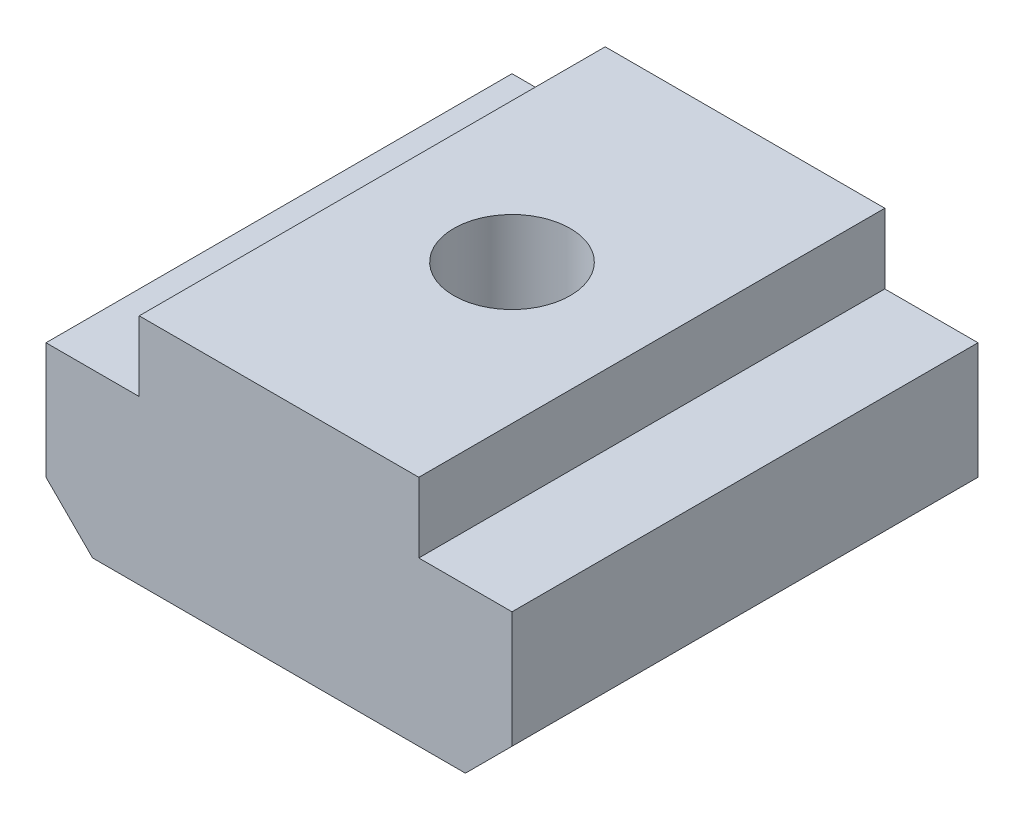
ISO-10303-21;
HEADER;
FILE_DESCRIPTION(('STEP AP214'),'2;1');
FILE_NAME('part.step','',(''),(''),'','','');
FILE_SCHEMA(('AUTOMOTIVE_DESIGN { 1 0 10303 214 1 1 1 1 }'));
ENDSEC;
DATA;
#1=APPLICATION_CONTEXT('core data for automotive mechanical design processes');
#2=APPLICATION_PROTOCOL_DEFINITION('international standard','automotive_design',2000,#1);
#3=PRODUCT_CONTEXT('',#1,'mechanical');
#4=PRODUCT('Part','Part','',(#3));
#5=PRODUCT_RELATED_PRODUCT_CATEGORY('part','',(#4));
#6=PRODUCT_DEFINITION_FORMATION('','',#4);
#7=PRODUCT_DEFINITION_CONTEXT('part definition',#1,'design');
#8=PRODUCT_DEFINITION('design','',#6,#7);
#9=PRODUCT_DEFINITION_SHAPE('','',#8);
#10=(LENGTH_UNIT() NAMED_UNIT(*) SI_UNIT(.MILLI.,.METRE.));
#11=(NAMED_UNIT(*) PLANE_ANGLE_UNIT() SI_UNIT($,.RADIAN.));
#12=(NAMED_UNIT(*) SI_UNIT($,.STERADIAN.) SOLID_ANGLE_UNIT());
#13=UNCERTAINTY_MEASURE_WITH_UNIT(LENGTH_MEASURE(1.E-05),#10,'distance_accuracy_value','');
#14=(GEOMETRIC_REPRESENTATION_CONTEXT(3) GLOBAL_UNCERTAINTY_ASSIGNED_CONTEXT((#13)) GLOBAL_UNIT_ASSIGNED_CONTEXT((#10,
#11,#12)) REPRESENTATION_CONTEXT('',''));
#15=CARTESIAN_POINT('',(0.,0.,0.));
#16=DIRECTION('',(0.,0.,1.));
#17=DIRECTION('',(1.,0.,0.));
#18=AXIS2_PLACEMENT_3D('',#15,#16,#17);
#19=CARTESIAN_POINT('',(-5.,1.,10.));
#20=DIRECTION('',(0.707106781186548,0.707106781186548,0.));
#21=DIRECTION('',(-0.707106781186548,0.707106781186548,0.));
#22=AXIS2_PLACEMENT_3D('',#19,#20,#21);
#23=PLANE('',#22);
#24=DIRECTION('',(0.707106781186548,-0.707106781186548,0.));
#25=VECTOR('',#24,1.);
#26=CARTESIAN_POINT('',(-5.,1.,0.));
#27=LINE('',#26,#25);
#28=CARTESIAN_POINT('',(-5.,1.,0.));
#29=VERTEX_POINT('',#28);
#30=CARTESIAN_POINT('',(-4.,0.,0.));
#31=VERTEX_POINT('',#30);
#32=EDGE_CURVE('E144',#29,#31,#27,.T.);
#33=ORIENTED_EDGE('',*,*,#32,.T.);
#34=DIRECTION('',(0.,0.,-1.));
#35=VECTOR('',#34,1.);
#36=CARTESIAN_POINT('',(-4.,0.,10.));
#37=LINE('',#36,#35);
#38=CARTESIAN_POINT('',(-4.,0.,10.));
#39=VERTEX_POINT('',#38);
#40=EDGE_CURVE('E11',#39,#31,#37,.T.);
#41=ORIENTED_EDGE('',*,*,#40,.F.);
#42=DIRECTION('',(0.707106781186548,-0.707106781186548,0.));
#43=VECTOR('',#42,1.);
#44=CARTESIAN_POINT('',(-5.,1.,10.));
#45=LINE('',#44,#43);
#46=CARTESIAN_POINT('',(-5.,1.,10.));
#47=VERTEX_POINT('',#46);
#48=EDGE_CURVE('E163',#47,#39,#45,.T.);
#49=ORIENTED_EDGE('',*,*,#48,.F.);
#50=DIRECTION('',(0.,0.,-1.));
#51=VECTOR('',#50,1.);
#52=CARTESIAN_POINT('',(-5.,1.,10.));
#53=LINE('',#52,#51);
#54=EDGE_CURVE('E140',#47,#29,#53,.T.);
#55=ORIENTED_EDGE('',*,*,#54,.T.);
#56=EDGE_LOOP('',(#33,#41,#49,#55));
#57=FACE_BOUND('',#56,.T.);
#58=ADVANCED_FACE('F36',(#57),#23,.F.);
#59=CARTESIAN_POINT('',(-4.,0.,10.));
#60=DIRECTION('',(0.,1.,0.));
#61=DIRECTION('',(0.,0.,1.));
#62=AXIS2_PLACEMENT_3D('',#59,#60,#61);
#63=PLANE('',#62);
#64=CARTESIAN_POINT('',(0.,0.,5.));
#65=DIRECTION('',(0.,1.,0.));
#66=DIRECTION('',(0.,0.,1.));
#67=AXIS2_PLACEMENT_3D('',#64,#65,#66);
#68=CIRCLE('',#67,1.25);
#69=CARTESIAN_POINT('',(0.,0.,6.25));
#70=VERTEX_POINT('',#69);
#71=EDGE_CURVE('E148',#70,#70,#68,.T.);
#72=ORIENTED_EDGE('',*,*,#71,.T.);
#73=EDGE_LOOP('',(#72));
#74=FACE_BOUND('',#73,.T.);
#75=DIRECTION('',(1.,0.,0.));
#76=VECTOR('',#75,1.);
#77=CARTESIAN_POINT('',(-4.,0.,0.));
#78=LINE('',#77,#76);
#79=CARTESIAN_POINT('',(4.,0.,0.));
#80=VERTEX_POINT('',#79);
#81=EDGE_CURVE('E147',#31,#80,#78,.T.);
#82=ORIENTED_EDGE('',*,*,#81,.T.);
#83=DIRECTION('',(0.,0.,-1.));
#84=VECTOR('',#83,1.);
#85=CARTESIAN_POINT('',(4.,0.,10.));
#86=LINE('',#85,#84);
#87=CARTESIAN_POINT('',(4.,0.,10.));
#88=VERTEX_POINT('',#87);
#89=EDGE_CURVE('E44',#88,#80,#86,.T.);
#90=ORIENTED_EDGE('',*,*,#89,.F.);
#91=DIRECTION('',(1.,0.,0.));
#92=VECTOR('',#91,1.);
#93=CARTESIAN_POINT('',(-4.,0.,10.));
#94=LINE('',#93,#92);
#95=EDGE_CURVE('E101',#39,#88,#94,.T.);
#96=ORIENTED_EDGE('',*,*,#95,.F.);
#97=ORIENTED_EDGE('',*,*,#40,.T.);
#98=EDGE_LOOP('',(#82,#90,#96,#97));
#99=FACE_BOUND('',#98,.T.);
#100=ADVANCED_FACE('F239',(#74,#99),#63,.F.);
#101=CARTESIAN_POINT('',(4.,0.,10.));
#102=DIRECTION('',(-0.707106781186548,0.707106781186548,0.));
#103=DIRECTION('',(-0.707106781186548,-0.707106781186548,0.));
#104=AXIS2_PLACEMENT_3D('',#101,#102,#103);
#105=PLANE('',#104);
#106=DIRECTION('',(0.707106781186548,0.707106781186548,0.));
#107=VECTOR('',#106,1.);
#108=CARTESIAN_POINT('',(4.,0.,0.));
#109=LINE('',#108,#107);
#110=CARTESIAN_POINT('',(5.,1.,0.));
#111=VERTEX_POINT('',#110);
#112=EDGE_CURVE('E150',#80,#111,#109,.T.);
#113=ORIENTED_EDGE('',*,*,#112,.T.);
#114=DIRECTION('',(0.,0.,-1.));
#115=VECTOR('',#114,1.);
#116=CARTESIAN_POINT('',(5.,1.,10.));
#117=LINE('',#116,#115);
#118=CARTESIAN_POINT('',(5.,1.,10.));
#119=VERTEX_POINT('',#118);
#120=EDGE_CURVE('E176',#119,#111,#117,.T.);
#121=ORIENTED_EDGE('',*,*,#120,.F.);
#122=DIRECTION('',(0.707106781186548,0.707106781186548,0.));
#123=VECTOR('',#122,1.);
#124=CARTESIAN_POINT('',(4.,0.,10.));
#125=LINE('',#124,#123);
#126=EDGE_CURVE('E184',#88,#119,#125,.T.);
#127=ORIENTED_EDGE('',*,*,#126,.F.);
#128=ORIENTED_EDGE('',*,*,#89,.T.);
#129=EDGE_LOOP('',(#113,#121,#127,#128));
#130=FACE_BOUND('',#129,.T.);
#131=ADVANCED_FACE('F182',(#130),#105,.F.);
#132=CARTESIAN_POINT('',(5.,1.,10.));
#133=DIRECTION('',(-1.,0.,0.));
#134=DIRECTION('',(0.,0.,1.));
#135=AXIS2_PLACEMENT_3D('',#132,#133,#134);
#136=PLANE('',#135);
#137=DIRECTION('',(0.,1.,0.));
#138=VECTOR('',#137,1.);
#139=CARTESIAN_POINT('',(5.,1.,0.));
#140=LINE('',#139,#138);
#141=CARTESIAN_POINT('',(5.,3.5,0.));
#142=VERTEX_POINT('',#141);
#143=EDGE_CURVE('E152',#111,#142,#140,.T.);
#144=ORIENTED_EDGE('',*,*,#143,.T.);
#145=DIRECTION('',(0.,0.,-1.));
#146=VECTOR('',#145,1.);
#147=CARTESIAN_POINT('',(5.,3.5,10.));
#148=LINE('',#147,#146);
#149=CARTESIAN_POINT('',(5.,3.5,10.));
#150=VERTEX_POINT('',#149);
#151=EDGE_CURVE('E173',#150,#142,#148,.T.);
#152=ORIENTED_EDGE('',*,*,#151,.F.);
#153=DIRECTION('',(0.,1.,0.));
#154=VECTOR('',#153,1.);
#155=CARTESIAN_POINT('',(5.,1.,10.));
#156=LINE('',#155,#154);
#157=EDGE_CURVE('E202',#119,#150,#156,.T.);
#158=ORIENTED_EDGE('',*,*,#157,.F.);
#159=ORIENTED_EDGE('',*,*,#120,.T.);
#160=EDGE_LOOP('',(#144,#152,#158,#159));
#161=FACE_BOUND('',#160,.T.);
#162=ADVANCED_FACE('F193',(#161),#136,.F.);
#163=CARTESIAN_POINT('',(5.,3.5,10.));
#164=DIRECTION('',(0.,-1.,0.));
#165=DIRECTION('',(1.,0.,0.));
#166=AXIS2_PLACEMENT_3D('',#163,#164,#165);
#167=PLANE('',#166);
#168=DIRECTION('',(-1.,0.,0.));
#169=VECTOR('',#168,1.);
#170=CARTESIAN_POINT('',(5.,3.5,0.));
#171=LINE('',#170,#169);
#172=CARTESIAN_POINT('',(3.,3.5,0.));
#173=VERTEX_POINT('',#172);
#174=EDGE_CURVE('E154',#142,#173,#171,.T.);
#175=ORIENTED_EDGE('',*,*,#174,.T.);
#176=DIRECTION('',(0.,0.,-1.));
#177=VECTOR('',#176,1.);
#178=CARTESIAN_POINT('',(3.,3.5,10.));
#179=LINE('',#178,#177);
#180=CARTESIAN_POINT('',(3.,3.5,10.));
#181=VERTEX_POINT('',#180);
#182=EDGE_CURVE('E170',#181,#173,#179,.T.);
#183=ORIENTED_EDGE('',*,*,#182,.F.);
#184=DIRECTION('',(-1.,0.,0.));
#185=VECTOR('',#184,1.);
#186=CARTESIAN_POINT('',(5.,3.5,10.));
#187=LINE('',#186,#185);
#188=EDGE_CURVE('E199',#150,#181,#187,.T.);
#189=ORIENTED_EDGE('',*,*,#188,.F.);
#190=ORIENTED_EDGE('',*,*,#151,.T.);
#191=EDGE_LOOP('',(#175,#183,#189,#190));
#192=FACE_BOUND('',#191,.T.);
#193=ADVANCED_FACE('F197',(#192),#167,.F.);
#194=CARTESIAN_POINT('',(3.,3.5,10.));
#195=DIRECTION('',(-1.,0.,0.));
#196=DIRECTION('',(0.,-1.,0.));
#197=AXIS2_PLACEMENT_3D('',#194,#195,#196);
#198=PLANE('',#197);
#199=DIRECTION('',(0.,1.,0.));
#200=VECTOR('',#199,1.);
#201=CARTESIAN_POINT('',(3.,3.5,0.));
#202=LINE('',#201,#200);
#203=CARTESIAN_POINT('',(3.,5.,0.));
#204=VERTEX_POINT('',#203);
#205=EDGE_CURVE('E156',#173,#204,#202,.T.);
#206=ORIENTED_EDGE('',*,*,#205,.T.);
#207=DIRECTION('',(0.,0.,-1.));
#208=VECTOR('',#207,1.);
#209=CARTESIAN_POINT('',(3.,5.,10.));
#210=LINE('',#209,#208);
#211=CARTESIAN_POINT('',(3.,5.,10.));
#212=VERTEX_POINT('',#211);
#213=EDGE_CURVE('E167',#212,#204,#210,.T.);
#214=ORIENTED_EDGE('',*,*,#213,.F.);
#215=DIRECTION('',(0.,1.,0.));
#216=VECTOR('',#215,1.);
#217=CARTESIAN_POINT('',(3.,3.5,10.));
#218=LINE('',#217,#216);
#219=EDGE_CURVE('E201',#181,#212,#218,.T.);
#220=ORIENTED_EDGE('',*,*,#219,.F.);
#221=ORIENTED_EDGE('',*,*,#182,.T.);
#222=EDGE_LOOP('',(#206,#214,#220,#221));
#223=FACE_BOUND('',#222,.T.);
#224=ADVANCED_FACE('F221',(#223),#198,.F.);
#225=CARTESIAN_POINT('',(3.,5.,10.));
#226=DIRECTION('',(0.,-1.,0.));
#227=DIRECTION('',(0.,0.,-1.));
#228=AXIS2_PLACEMENT_3D('',#225,#226,#227);
#229=PLANE('',#228);
#230=CARTESIAN_POINT('',(0.,5.,5.));
#231=DIRECTION('',(0.,1.,0.));
#232=DIRECTION('',(0.,0.,1.));
#233=AXIS2_PLACEMENT_3D('',#230,#231,#232);
#234=CIRCLE('',#233,1.25);
#235=CARTESIAN_POINT('',(0.,5.,6.25));
#236=VERTEX_POINT('',#235);
#237=EDGE_CURVE('E212',#236,#236,#234,.T.);
#238=ORIENTED_EDGE('',*,*,#237,.F.);
#239=EDGE_LOOP('',(#238));
#240=FACE_BOUND('',#239,.T.);
#241=DIRECTION('',(-1.,0.,0.));
#242=VECTOR('',#241,1.);
#243=CARTESIAN_POINT('',(3.,5.,0.));
#244=LINE('',#243,#242);
#245=CARTESIAN_POINT('',(-3.,5.,0.));
#246=VERTEX_POINT('',#245);
#247=EDGE_CURVE('E158',#204,#246,#244,.T.);
#248=ORIENTED_EDGE('',*,*,#247,.T.);
#249=DIRECTION('',(0.,0.,-1.));
#250=VECTOR('',#249,1.);
#251=CARTESIAN_POINT('',(-3.,5.,10.));
#252=LINE('',#251,#250);
#253=CARTESIAN_POINT('',(-3.,5.,10.));
#254=VERTEX_POINT('',#253);
#255=EDGE_CURVE('E135',#254,#246,#252,.T.);
#256=ORIENTED_EDGE('',*,*,#255,.F.);
#257=DIRECTION('',(-1.,0.,0.));
#258=VECTOR('',#257,1.);
#259=CARTESIAN_POINT('',(3.,5.,10.));
#260=LINE('',#259,#258);
#261=EDGE_CURVE('E126',#212,#254,#260,.T.);
#262=ORIENTED_EDGE('',*,*,#261,.F.);
#263=ORIENTED_EDGE('',*,*,#213,.T.);
#264=EDGE_LOOP('',(#248,#256,#262,#263));
#265=FACE_BOUND('',#264,.T.);
#266=ADVANCED_FACE('F218',(#240,#265),#229,.F.);
#267=CARTESIAN_POINT('',(-3.,5.,10.));
#268=DIRECTION('',(1.,0.,0.));
#269=DIRECTION('',(0.,1.,0.));
#270=AXIS2_PLACEMENT_3D('',#267,#268,#269);
#271=PLANE('',#270);
#272=DIRECTION('',(0.,-1.,0.));
#273=VECTOR('',#272,1.);
#274=CARTESIAN_POINT('',(-3.,5.,0.));
#275=LINE('',#274,#273);
#276=CARTESIAN_POINT('',(-3.,3.5,0.));
#277=VERTEX_POINT('',#276);
#278=EDGE_CURVE('E134',#246,#277,#275,.T.);
#279=ORIENTED_EDGE('',*,*,#278,.T.);
#280=DIRECTION('',(0.,0.,-1.));
#281=VECTOR('',#280,1.);
#282=CARTESIAN_POINT('',(-3.,3.5,10.));
#283=LINE('',#282,#281);
#284=CARTESIAN_POINT('',(-3.,3.5,10.));
#285=VERTEX_POINT('',#284);
#286=EDGE_CURVE('E131',#285,#277,#283,.T.);
#287=ORIENTED_EDGE('',*,*,#286,.F.);
#288=DIRECTION('',(0.,-1.,0.));
#289=VECTOR('',#288,1.);
#290=CARTESIAN_POINT('',(-3.,5.,10.));
#291=LINE('',#290,#289);
#292=EDGE_CURVE('E120',#254,#285,#291,.T.);
#293=ORIENTED_EDGE('',*,*,#292,.F.);
#294=ORIENTED_EDGE('',*,*,#255,.T.);
#295=EDGE_LOOP('',(#279,#287,#293,#294));
#296=FACE_BOUND('',#295,.T.);
#297=ADVANCED_FACE('F132',(#296),#271,.F.);
#298=CARTESIAN_POINT('',(-3.,3.5,10.));
#299=DIRECTION('',(0.,-1.,0.));
#300=DIRECTION('',(0.,0.,-1.));
#301=AXIS2_PLACEMENT_3D('',#298,#299,#300);
#302=PLANE('',#301);
#303=DIRECTION('',(-1.,0.,0.));
#304=VECTOR('',#303,1.);
#305=CARTESIAN_POINT('',(-3.,3.5,0.));
#306=LINE('',#305,#304);
#307=CARTESIAN_POINT('',(-5.,3.5,0.));
#308=VERTEX_POINT('',#307);
#309=EDGE_CURVE('E87',#277,#308,#306,.T.);
#310=ORIENTED_EDGE('',*,*,#309,.T.);
#311=DIRECTION('',(0.,0.,-1.));
#312=VECTOR('',#311,1.);
#313=CARTESIAN_POINT('',(-5.,3.5,10.));
#314=LINE('',#313,#312);
#315=CARTESIAN_POINT('',(-5.,3.5,10.));
#316=VERTEX_POINT('',#315);
#317=EDGE_CURVE('E136',#316,#308,#314,.T.);
#318=ORIENTED_EDGE('',*,*,#317,.F.);
#319=DIRECTION('',(-1.,0.,0.));
#320=VECTOR('',#319,1.);
#321=CARTESIAN_POINT('',(-3.,3.5,10.));
#322=LINE('',#321,#320);
#323=EDGE_CURVE('E124',#285,#316,#322,.T.);
#324=ORIENTED_EDGE('',*,*,#323,.F.);
#325=ORIENTED_EDGE('',*,*,#286,.T.);
#326=EDGE_LOOP('',(#310,#318,#324,#325));
#327=FACE_BOUND('',#326,.T.);
#328=ADVANCED_FACE('F138',(#327),#302,.F.);
#329=CARTESIAN_POINT('',(-5.,3.5,10.));
#330=DIRECTION('',(1.,0.,0.));
#331=DIRECTION('',(0.,1.,0.));
#332=AXIS2_PLACEMENT_3D('',#329,#330,#331);
#333=PLANE('',#332);
#334=DIRECTION('',(0.,-1.,0.));
#335=VECTOR('',#334,1.);
#336=CARTESIAN_POINT('',(-5.,3.5,0.));
#337=LINE('',#336,#335);
#338=EDGE_CURVE('E93',#308,#29,#337,.T.);
#339=ORIENTED_EDGE('',*,*,#338,.T.);
#340=ORIENTED_EDGE('',*,*,#54,.F.);
#341=DIRECTION('',(0.,-1.,0.));
#342=VECTOR('',#341,1.);
#343=CARTESIAN_POINT('',(-5.,3.5,10.));
#344=LINE('',#343,#342);
#345=EDGE_CURVE('E52',#316,#47,#344,.T.);
#346=ORIENTED_EDGE('',*,*,#345,.F.);
#347=ORIENTED_EDGE('',*,*,#317,.T.);
#348=EDGE_LOOP('',(#339,#340,#346,#347));
#349=FACE_BOUND('',#348,.T.);
#350=ADVANCED_FACE('F228',(#349),#333,.F.);
#351=CARTESIAN_POINT('',(0.,0.,10.));
#352=DIRECTION('',(0.,0.,1.));
#353=DIRECTION('',(1.,0.,0.));
#354=AXIS2_PLACEMENT_3D('',#351,#352,#353);
#355=PLANE('',#354);
#356=ORIENTED_EDGE('',*,*,#48,.T.);
#357=ORIENTED_EDGE('',*,*,#95,.T.);
#358=ORIENTED_EDGE('',*,*,#126,.T.);
#359=ORIENTED_EDGE('',*,*,#157,.T.);
#360=ORIENTED_EDGE('',*,*,#188,.T.);
#361=ORIENTED_EDGE('',*,*,#219,.T.);
#362=ORIENTED_EDGE('',*,*,#261,.T.);
#363=ORIENTED_EDGE('',*,*,#292,.T.);
#364=ORIENTED_EDGE('',*,*,#323,.T.);
#365=ORIENTED_EDGE('',*,*,#345,.T.);
#366=EDGE_LOOP('',(#356,#357,#358,#359,#360,#361,#362,#363,#364,#365));
#367=FACE_BOUND('',#366,.T.);
#368=ADVANCED_FACE('F122',(#367),#355,.T.);
#369=CARTESIAN_POINT('',(0.,0.,0.));
#370=DIRECTION('',(0.,0.,1.));
#371=DIRECTION('',(1.,0.,0.));
#372=AXIS2_PLACEMENT_3D('',#369,#370,#371);
#373=PLANE('',#372);
#374=ORIENTED_EDGE('',*,*,#32,.F.);
#375=ORIENTED_EDGE('',*,*,#338,.F.);
#376=ORIENTED_EDGE('',*,*,#309,.F.);
#377=ORIENTED_EDGE('',*,*,#278,.F.);
#378=ORIENTED_EDGE('',*,*,#247,.F.);
#379=ORIENTED_EDGE('',*,*,#205,.F.);
#380=ORIENTED_EDGE('',*,*,#174,.F.);
#381=ORIENTED_EDGE('',*,*,#143,.F.);
#382=ORIENTED_EDGE('',*,*,#112,.F.);
#383=ORIENTED_EDGE('',*,*,#81,.F.);
#384=EDGE_LOOP('',(#374,#375,#376,#377,#378,#379,#380,#381,#382,#383));
#385=FACE_BOUND('',#384,.T.);
#386=ADVANCED_FACE('F188',(#385),#373,.F.);
#387=CARTESIAN_POINT('',(0.,5.,5.));
#388=DIRECTION('',(0.,1.,0.));
#389=DIRECTION('',(0.,0.,1.));
#390=AXIS2_PLACEMENT_3D('',#387,#388,#389);
#391=CYLINDRICAL_SURFACE('',#390,1.25);
#392=ORIENTED_EDGE('',*,*,#71,.F.);
#393=EDGE_LOOP('',(#392));
#394=FACE_BOUND('',#393,.T.);
#395=ORIENTED_EDGE('',*,*,#237,.T.);
#396=EDGE_LOOP('',(#395));
#397=FACE_BOUND('',#396,.T.);
#398=ADVANCED_FACE('F216',(#394,#397),#391,.F.);
#399=CLOSED_SHELL('',(#58,#100,#131,#162,#193,#224,#266,#297,#328,#350,#368,#386,#398));
#400=MANIFOLD_SOLID_BREP('B2',#399);
#401=ADVANCED_BREP_SHAPE_REPRESENTATION('',(#18,#400),#14);
#402=SHAPE_DEFINITION_REPRESENTATION(#9,#401);
ENDSEC;
END-ISO-10303-21;
